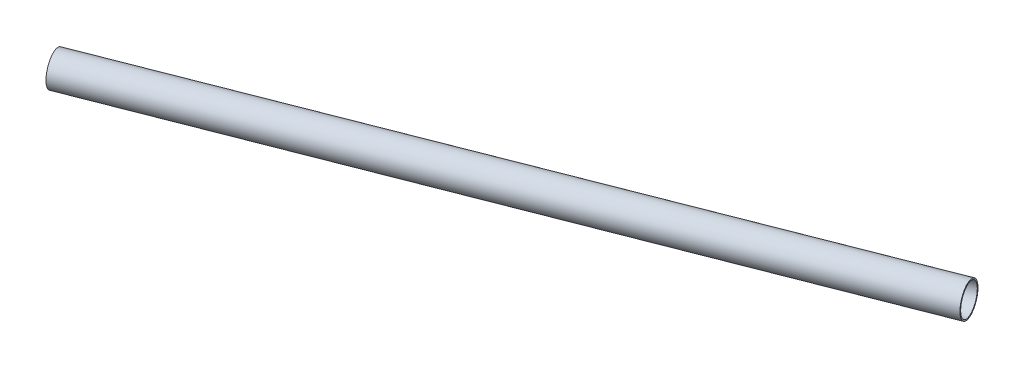
ISO-10303-21;
HEADER;
FILE_DESCRIPTION(('STEP AP214'),'2;1');
FILE_NAME('part.step','',(''),(''),'','','');
FILE_SCHEMA(('AUTOMOTIVE_DESIGN { 1 0 10303 214 1 1 1 1 }'));
ENDSEC;
DATA;
#1=APPLICATION_CONTEXT('core data for automotive mechanical design processes');
#2=APPLICATION_PROTOCOL_DEFINITION('international standard','automotive_design',2000,#1);
#3=PRODUCT_CONTEXT('',#1,'mechanical');
#4=PRODUCT('Part','Part','',(#3));
#5=PRODUCT_RELATED_PRODUCT_CATEGORY('part','',(#4));
#6=PRODUCT_DEFINITION_FORMATION('','',#4);
#7=PRODUCT_DEFINITION_CONTEXT('part definition',#1,'design');
#8=PRODUCT_DEFINITION('design','',#6,#7);
#9=PRODUCT_DEFINITION_SHAPE('','',#8);
#10=(LENGTH_UNIT() NAMED_UNIT(*) SI_UNIT(.MILLI.,.METRE.));
#11=(NAMED_UNIT(*) PLANE_ANGLE_UNIT() SI_UNIT($,.RADIAN.));
#12=(NAMED_UNIT(*) SI_UNIT($,.STERADIAN.) SOLID_ANGLE_UNIT());
#13=UNCERTAINTY_MEASURE_WITH_UNIT(LENGTH_MEASURE(1.E-05),#10,'distance_accuracy_value','');
#14=(GEOMETRIC_REPRESENTATION_CONTEXT(3) GLOBAL_UNCERTAINTY_ASSIGNED_CONTEXT((#13)) GLOBAL_UNIT_ASSIGNED_CONTEXT((#10,
#11,#12)) REPRESENTATION_CONTEXT('',''));
#15=CARTESIAN_POINT('',(0.,0.,0.));
#16=DIRECTION('',(0.,0.,1.));
#17=DIRECTION('',(1.,0.,0.));
#18=AXIS2_PLACEMENT_3D('',#15,#16,#17);
#19=CARTESIAN_POINT('',(27.9118605828743,0.,-24.7148490312921));
#20=DIRECTION('',(0.931381277048527,0.,-0.364045212526487));
#21=DIRECTION('',(-0.364045212526487,0.,-0.931381277048527));
#22=AXIS2_PLACEMENT_3D('',#19,#20,#21);
#23=PLANE('',#22);
#24=CARTESIAN_POINT('',(27.9118605828743,0.,-24.714849031292));
#25=DIRECTION('',(0.931381277048527,0.,-0.364045212526487));
#26=DIRECTION('',(-0.364045212526487,0.,-0.931381277048527));
#27=AXIS2_PLACEMENT_3D('',#24,#25,#26);
#28=CIRCLE('',#27,11.5);
#29=CARTESIAN_POINT('',(23.7253406388197,0.,-35.4257337173501));
#30=VERTEX_POINT('',#29);
#31=EDGE_CURVE('E72',#30,#30,#28,.F.);
#32=ORIENTED_EDGE('',*,*,#31,.F.);
#33=EDGE_LOOP('',(#32));
#34=FACE_BOUND('',#33,.T.);
#35=CARTESIAN_POINT('',(27.9118605828743,0.,-24.7148490312921));
#36=DIRECTION('',(0.931381277048527,0.,-0.364045212526487));
#37=DIRECTION('',(-0.364045212526487,0.,-0.931381277048527));
#38=AXIS2_PLACEMENT_3D('',#35,#36,#37);
#39=CIRCLE('',#38,12.5);
#40=CARTESIAN_POINT('',(23.3612954262932,0.,-36.3571149943986));
#41=VERTEX_POINT('',#40);
#42=EDGE_CURVE('E62',#41,#41,#39,.T.);
#43=ORIENTED_EDGE('',*,*,#42,.F.);
#44=EDGE_LOOP('',(#43));
#45=FACE_BOUND('',#44,.T.);
#46=ADVANCED_FACE('F55',(#34,#45),#23,.F.);
#47=CARTESIAN_POINT('',(544.640102873015,0.,-226.686315946609));
#48=DIRECTION('',(0.931381277048527,0.,-0.364045212526487));
#49=DIRECTION('',(-0.364045212526487,0.,-0.931381277048527));
#50=AXIS2_PLACEMENT_3D('',#47,#48,#49);
#51=PLANE('',#50);
#52=CARTESIAN_POINT('',(544.640102873015,0.,-226.686315946609));
#53=DIRECTION('',(0.931381277048527,0.,-0.364045212526487));
#54=DIRECTION('',(-0.364045212526487,0.,-0.931381277048527));
#55=AXIS2_PLACEMENT_3D('',#52,#53,#54);
#56=CIRCLE('',#55,11.5);
#57=CARTESIAN_POINT('',(540.45358292896,0.,-237.397200632667));
#58=VERTEX_POINT('',#57);
#59=EDGE_CURVE('E67',#58,#58,#56,.F.);
#60=ORIENTED_EDGE('',*,*,#59,.T.);
#61=EDGE_LOOP('',(#60));
#62=FACE_BOUND('',#61,.T.);
#63=CARTESIAN_POINT('',(544.640102873015,0.,-226.686315946609));
#64=DIRECTION('',(0.931381277048527,0.,-0.364045212526487));
#65=DIRECTION('',(-0.364045212526487,0.,-0.931381277048527));
#66=AXIS2_PLACEMENT_3D('',#63,#64,#65);
#67=CIRCLE('',#66,12.5);
#68=CARTESIAN_POINT('',(540.089537716433,0.,-238.328581909715));
#69=VERTEX_POINT('',#68);
#70=EDGE_CURVE('E11',#69,#69,#67,.T.);
#71=ORIENTED_EDGE('',*,*,#70,.T.);
#72=EDGE_LOOP('',(#71));
#73=FACE_BOUND('',#72,.T.);
#74=ADVANCED_FACE('F84',(#62,#73),#51,.T.);
#75=CARTESIAN_POINT('',(27.9118605828743,0.,-24.7148490312921));
#76=DIRECTION('',(0.931381277048527,0.,-0.364045212526487));
#77=DIRECTION('',(-0.364045212526487,0.,-0.931381277048527));
#78=AXIS2_PLACEMENT_3D('',#75,#76,#77);
#79=CYLINDRICAL_SURFACE('',#78,12.5);
#80=ORIENTED_EDGE('',*,*,#70,.F.);
#81=EDGE_LOOP('',(#80));
#82=FACE_BOUND('',#81,.T.);
#83=ORIENTED_EDGE('',*,*,#42,.T.);
#84=EDGE_LOOP('',(#83));
#85=FACE_BOUND('',#84,.T.);
#86=ADVANCED_FACE('F88',(#82,#85),#79,.T.);
#87=CARTESIAN_POINT('',(24.1863354746804,0.,-23.2586681811862));
#88=DIRECTION('',(0.931381277048527,0.,-0.364045212526487));
#89=DIRECTION('',(-0.364045212526487,0.,-0.931381277048527));
#90=AXIS2_PLACEMENT_3D('',#87,#88,#89);
#91=CYLINDRICAL_SURFACE('',#90,11.5);
#92=ORIENTED_EDGE('',*,*,#31,.T.);
#93=EDGE_LOOP('',(#92));
#94=FACE_BOUND('',#93,.T.);
#95=ORIENTED_EDGE('',*,*,#59,.F.);
#96=EDGE_LOOP('',(#95));
#97=FACE_BOUND('',#96,.T.);
#98=ADVANCED_FACE('F79',(#94,#97),#91,.F.);
#99=CLOSED_SHELL('',(#46,#74,#86,#98));
#100=MANIFOLD_SOLID_BREP('B2',#99);
#101=ADVANCED_BREP_SHAPE_REPRESENTATION('',(#18,#100),#14);
#102=SHAPE_DEFINITION_REPRESENTATION(#9,#101);
ENDSEC;
END-ISO-10303-21;
